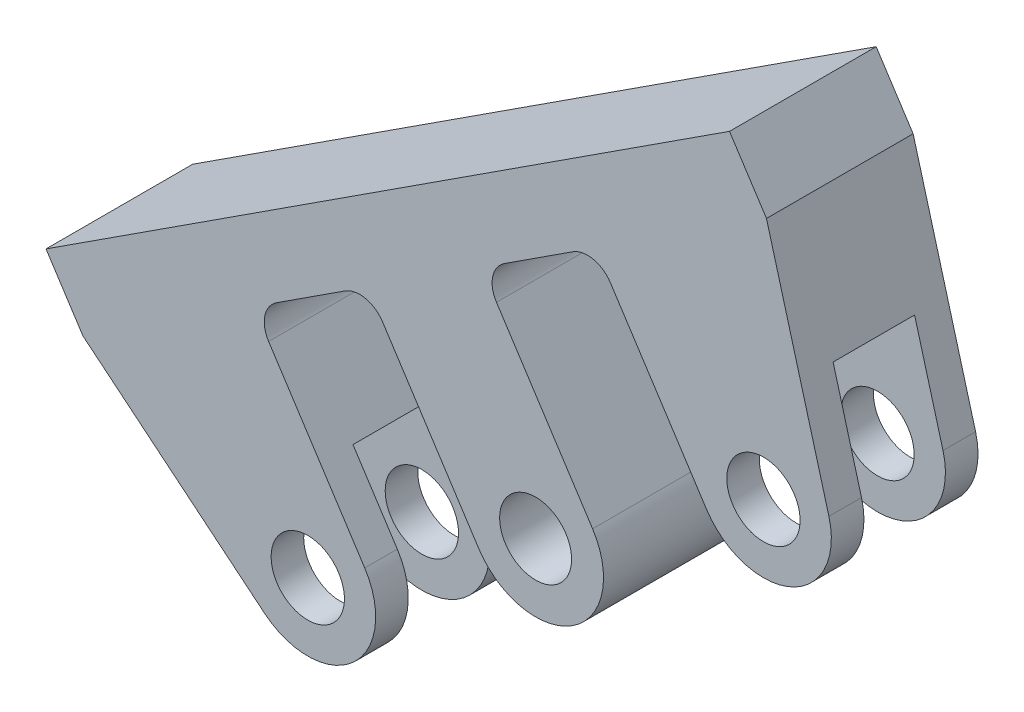
ISO-10303-21;
HEADER;
FILE_DESCRIPTION(('STEP AP214'),'2;1');
FILE_NAME('part.step','',(''),(''),'','','');
FILE_SCHEMA(('AUTOMOTIVE_DESIGN { 1 0 10303 214 1 1 1 1 }'));
ENDSEC;
DATA;
#1=APPLICATION_CONTEXT('core data for automotive mechanical design processes');
#2=APPLICATION_PROTOCOL_DEFINITION('international standard','automotive_design',2000,#1);
#3=PRODUCT_CONTEXT('',#1,'mechanical');
#4=PRODUCT('Part','Part','',(#3));
#5=PRODUCT_RELATED_PRODUCT_CATEGORY('part','',(#4));
#6=PRODUCT_DEFINITION_FORMATION('','',#4);
#7=PRODUCT_DEFINITION_CONTEXT('part definition',#1,'design');
#8=PRODUCT_DEFINITION('design','',#6,#7);
#9=PRODUCT_DEFINITION_SHAPE('','',#8);
#10=(LENGTH_UNIT() NAMED_UNIT(*) SI_UNIT(.MILLI.,.METRE.));
#11=(NAMED_UNIT(*) PLANE_ANGLE_UNIT() SI_UNIT($,.RADIAN.));
#12=(NAMED_UNIT(*) SI_UNIT($,.STERADIAN.) SOLID_ANGLE_UNIT());
#13=UNCERTAINTY_MEASURE_WITH_UNIT(LENGTH_MEASURE(1.E-05),#10,'distance_accuracy_value','');
#14=(GEOMETRIC_REPRESENTATION_CONTEXT(3) GLOBAL_UNCERTAINTY_ASSIGNED_CONTEXT((#13)) GLOBAL_UNIT_ASSIGNED_CONTEXT((#10,
#11,#12)) REPRESENTATION_CONTEXT('',''));
#15=CARTESIAN_POINT('',(0.,0.,0.));
#16=DIRECTION('',(0.,0.,1.));
#17=DIRECTION('',(1.,0.,0.));
#18=AXIS2_PLACEMENT_3D('',#15,#16,#17);
#19=CARTESIAN_POINT('',(-3.17337998993445,28.2201994932616,-50.8));
#20=DIRECTION('',(0.838850692859666,0.544361566505993,0.));
#21=DIRECTION('',(-0.544361566505993,0.838850692859666,0.));
#22=AXIS2_PLACEMENT_3D('',#19,#20,#21);
#23=PLANE('',#22);
#24=DIRECTION('',(0.,0.,1.));
#25=VECTOR('',#24,1.);
#26=CARTESIAN_POINT('',(0.283315957378587,22.8934975936028,-50.8));
#27=LINE('',#26,#25);
#28=CARTESIAN_POINT('',(0.283315957378587,22.8934975936028,-32.258));
#29=VERTEX_POINT('',#28);
#30=CARTESIAN_POINT('',(0.283315957378587,22.8934975936028,-18.542));
#31=VERTEX_POINT('',#30);
#32=EDGE_CURVE('E433',#29,#31,#27,.T.);
#33=ORIENTED_EDGE('',*,*,#32,.F.);
#34=DIRECTION('',(-0.544361566505993,0.838850692859666,0.));
#35=VECTOR('',#34,1.);
#36=CARTESIAN_POINT('',(-3.17337998993445,28.2201994932616,-32.258));
#37=LINE('',#36,#35);
#38=CARTESIAN_POINT('',(-3.17337998993444,28.2201994932616,-32.258));
#39=VERTEX_POINT('',#38);
#40=EDGE_CURVE('E562',#29,#39,#37,.T.);
#41=ORIENTED_EDGE('',*,*,#40,.T.);
#42=DIRECTION('',(0.,0.,1.));
#43=VECTOR('',#42,1.);
#44=CARTESIAN_POINT('',(-3.17337998993445,28.2201994932616,-50.8));
#45=LINE('',#44,#43);
#46=CARTESIAN_POINT('',(-3.17337998993444,28.2201994932616,-18.542));
#47=VERTEX_POINT('',#46);
#48=EDGE_CURVE('E319',#39,#47,#45,.T.);
#49=ORIENTED_EDGE('',*,*,#48,.T.);
#50=DIRECTION('',(-0.544361566505993,0.838850692859666,0.));
#51=VECTOR('',#50,1.);
#52=CARTESIAN_POINT('',(-3.17337998993445,28.2201994932616,-18.542));
#53=LINE('',#52,#51);
#54=EDGE_CURVE('E417',#31,#47,#53,.T.);
#55=ORIENTED_EDGE('',*,*,#54,.F.);
#56=EDGE_LOOP('',(#33,#41,#49,#55));
#57=FACE_BOUND('',#56,.T.);
#58=ADVANCED_FACE('F129',(#57),#23,.T.);
#59=CARTESIAN_POINT('',(-67.093802785841,-13.260151874495,-50.8));
#60=DIRECTION('',(-0.838850692859666,-0.544361566505993,0.));
#61=DIRECTION('',(0.544361566505993,-0.838850692859666,0.));
#62=AXIS2_PLACEMENT_3D('',#59,#60,#61);
#63=PLANE('',#62);
#64=DIRECTION('',(0.,0.,1.));
#65=VECTOR('',#64,1.);
#66=CARTESIAN_POINT('',(-67.093802785841,-13.260151874495,-50.8));
#67=LINE('',#66,#65);
#68=CARTESIAN_POINT('',(-67.093802785841,-13.2601518744951,-32.258));
#69=VERTEX_POINT('',#68);
#70=CARTESIAN_POINT('',(-67.093802785841,-13.2601518744951,-18.542));
#71=VERTEX_POINT('',#70);
#72=EDGE_CURVE('E317',#69,#71,#67,.T.);
#73=ORIENTED_EDGE('',*,*,#72,.F.);
#74=DIRECTION('',(0.544361566505993,-0.838850692859666,0.));
#75=VECTOR('',#74,1.);
#76=CARTESIAN_POINT('',(-67.093802785841,-13.260151874495,-32.258));
#77=LINE('',#76,#75);
#78=CARTESIAN_POINT('',(-63.637106838528,-18.5868537741538,-32.258));
#79=VERTEX_POINT('',#78);
#80=EDGE_CURVE('E299',#69,#79,#77,.T.);
#81=ORIENTED_EDGE('',*,*,#80,.T.);
#82=DIRECTION('',(0.,0.,1.));
#83=VECTOR('',#82,1.);
#84=CARTESIAN_POINT('',(-63.637106838528,-18.5868537741538,-50.8));
#85=LINE('',#84,#83);
#86=CARTESIAN_POINT('',(-63.637106838528,-18.5868537741538,-18.542));
#87=VERTEX_POINT('',#86);
#88=EDGE_CURVE('E422',#79,#87,#85,.T.);
#89=ORIENTED_EDGE('',*,*,#88,.T.);
#90=DIRECTION('',(0.544361566505993,-0.838850692859666,0.));
#91=VECTOR('',#90,1.);
#92=CARTESIAN_POINT('',(-67.093802785841,-13.260151874495,-18.542));
#93=LINE('',#92,#91);
#94=EDGE_CURVE('E325',#71,#87,#93,.T.);
#95=ORIENTED_EDGE('',*,*,#94,.F.);
#96=EDGE_LOOP('',(#73,#81,#89,#95));
#97=FACE_BOUND('',#96,.T.);
#98=ADVANCED_FACE('F323',(#97),#63,.T.);
#99=CARTESIAN_POINT('',(-3.17337998993445,28.2201994932616,-50.8));
#100=DIRECTION('',(-0.544361566505992,0.838850692859666,0.));
#101=DIRECTION('',(-0.838850692859666,-0.544361566505992,0.));
#102=AXIS2_PLACEMENT_3D('',#99,#100,#101);
#103=PLANE('',#102);
#104=ORIENTED_EDGE('',*,*,#48,.F.);
#105=DIRECTION('',(0.838850692859666,0.544361566505993,0.));
#106=VECTOR('',#105,1.);
#107=CARTESIAN_POINT('',(-76.5660362480968,-19.4070381913508,-32.258));
#108=LINE('',#107,#106);
#109=EDGE_CURVE('E303',#69,#39,#108,.T.);
#110=ORIENTED_EDGE('',*,*,#109,.F.);
#111=ORIENTED_EDGE('',*,*,#72,.T.);
#112=DIRECTION('',(0.838850692859666,0.544361566505993,0.));
#113=VECTOR('',#112,1.);
#114=CARTESIAN_POINT('',(-76.5660362480968,-19.4070381913508,-18.542));
#115=LINE('',#114,#113);
#116=EDGE_CURVE('E501',#71,#47,#115,.T.);
#117=ORIENTED_EDGE('',*,*,#116,.T.);
#118=EDGE_LOOP('',(#104,#110,#111,#117));
#119=FACE_BOUND('',#118,.T.);
#120=ADVANCED_FACE('F315',(#119),#103,.T.);
#121=CARTESIAN_POINT('',(-21.3068075986355,-13.8267837892522,-50.8));
#122=DIRECTION('',(0.,0.,1.));
#123=DIRECTION('',(1.,0.,0.));
#124=AXIS2_PLACEMENT_3D('',#121,#122,#123);
#125=CYLINDRICAL_SURFACE('',#124,6.35);
#126=CARTESIAN_POINT('',(-21.3068075986355,-13.8267837892522,-32.258));
#127=DIRECTION('',(0.,0.,-1.));
#128=DIRECTION('',(-1.,0.,0.));
#129=AXIS2_PLACEMENT_3D('',#126,#127,#128);
#130=CIRCLE('',#129,6.35);
#131=CARTESIAN_POINT('',(-26.6335094982944,-17.2834797365653,-32.258));
#132=VERTEX_POINT('',#131);
#133=CARTESIAN_POINT('',(-15.9801056989766,-10.3700878419392,-32.258));
#134=VERTEX_POINT('',#133);
#135=EDGE_CURVE('E393',#132,#134,#130,.F.);
#136=ORIENTED_EDGE('',*,*,#135,.T.);
#137=DIRECTION('',(0.,0.,1.));
#138=VECTOR('',#137,1.);
#139=CARTESIAN_POINT('',(-15.9801056989766,-10.3700878419392,-50.8));
#140=LINE('',#139,#138);
#141=CARTESIAN_POINT('',(-15.9801056989766,-10.3700878419392,-18.542));
#142=VERTEX_POINT('',#141);
#143=EDGE_CURVE('E392',#134,#142,#140,.T.);
#144=ORIENTED_EDGE('',*,*,#143,.T.);
#145=CARTESIAN_POINT('',(-21.3068075986355,-13.8267837892522,-18.542));
#146=DIRECTION('',(0.,0.,-1.));
#147=DIRECTION('',(0.,1.,0.));
#148=AXIS2_PLACEMENT_3D('',#145,#146,#147);
#149=CIRCLE('',#148,6.35);
#150=CARTESIAN_POINT('',(-26.6335094982944,-17.2834797365653,-18.542));
#151=VERTEX_POINT('',#150);
#152=EDGE_CURVE('E409',#151,#142,#149,.F.);
#153=ORIENTED_EDGE('',*,*,#152,.F.);
#154=DIRECTION('',(0.,0.,1.));
#155=VECTOR('',#154,1.);
#156=CARTESIAN_POINT('',(-26.6335094982944,-17.2834797365653,-50.8));
#157=LINE('',#156,#155);
#158=EDGE_CURVE('E457',#132,#151,#157,.T.);
#159=ORIENTED_EDGE('',*,*,#158,.F.);
#160=EDGE_LOOP('',(#136,#144,#153,#159));
#161=FACE_BOUND('',#160,.T.);
#162=ADVANCED_FACE('F576',(#161),#125,.T.);
#163=CARTESIAN_POINT('',(-42.6136151972711,-27.6535675785044,-50.8));
#164=DIRECTION('',(0.,0.,1.));
#165=DIRECTION('',(1.,0.,0.));
#166=AXIS2_PLACEMENT_3D('',#163,#164,#165);
#167=CYLINDRICAL_SURFACE('',#166,6.35);
#168=CARTESIAN_POINT('',(-42.6136151972711,-27.6535675785044,-32.258));
#169=DIRECTION('',(0.,0.,-1.));
#170=DIRECTION('',(-1.,0.,0.));
#171=AXIS2_PLACEMENT_3D('',#168,#169,#170);
#172=CIRCLE('',#171,6.35);
#173=CARTESIAN_POINT('',(-46.6468082414941,-32.5582443128092,-32.258));
#174=VERTEX_POINT('',#173);
#175=CARTESIAN_POINT('',(-37.2869132976122,-24.1968716311914,-32.258));
#176=VERTEX_POINT('',#175);
#177=EDGE_CURVE('E311',#174,#176,#172,.F.);
#178=ORIENTED_EDGE('',*,*,#177,.T.);
#179=DIRECTION('',(0.,0.,1.));
#180=VECTOR('',#179,1.);
#181=CARTESIAN_POINT('',(-37.2869132976122,-24.1968716311914,-50.8));
#182=LINE('',#181,#180);
#183=CARTESIAN_POINT('',(-37.2869132976122,-24.1968716311914,-29.21));
#184=VERTEX_POINT('',#183);
#185=EDGE_CURVE('E458',#176,#184,#182,.T.);
#186=ORIENTED_EDGE('',*,*,#185,.T.);
#187=CARTESIAN_POINT('',(-42.6136151972711,-27.6535675785044,-29.21));
#188=DIRECTION('',(0.,0.,1.));
#189=DIRECTION('',(1.,0.,0.));
#190=AXIS2_PLACEMENT_3D('',#187,#188,#189);
#191=CIRCLE('',#190,6.35);
#192=CARTESIAN_POINT('',(-46.6468082414941,-32.5582443128092,-29.21));
#193=VERTEX_POINT('',#192);
#194=EDGE_CURVE('E468',#193,#184,#191,.T.);
#195=ORIENTED_EDGE('',*,*,#194,.F.);
#196=DIRECTION('',(0.,0.,1.));
#197=VECTOR('',#196,1.);
#198=CARTESIAN_POINT('',(-46.6468082414941,-32.5582443128092,-50.8));
#199=LINE('',#198,#197);
#200=EDGE_CURVE('E420',#174,#193,#199,.T.);
#201=ORIENTED_EDGE('',*,*,#200,.F.);
#202=EDGE_LOOP('',(#178,#186,#195,#201));
#203=FACE_BOUND('',#202,.T.);
#204=ADVANCED_FACE('F506',(#203),#167,.T.);
#205=CARTESIAN_POINT('',(-37.2869132976122,-24.1968716311914,-50.8));
#206=DIRECTION('',(0.838850692859666,0.544361566505992,0.));
#207=DIRECTION('',(-0.544361566505992,0.838850692859667,0.));
#208=AXIS2_PLACEMENT_3D('',#205,#206,#207);
#209=PLANE('',#208);
#210=DIRECTION('',(-0.544361566505992,0.838850692859667,0.));
#211=VECTOR('',#210,1.);
#212=CARTESIAN_POINT('',(-37.2869132976122,-24.1968716311914,-32.258));
#213=LINE('',#212,#211);
#214=CARTESIAN_POINT('',(-46.2743227606261,-10.3474466920783,-32.258));
#215=VERTEX_POINT('',#214);
#216=EDGE_CURVE('E310',#176,#215,#213,.T.);
#217=ORIENTED_EDGE('',*,*,#216,.T.);
#218=DIRECTION('',(0.,0.,1.));
#219=VECTOR('',#218,1.);
#220=CARTESIAN_POINT('',(-46.2743227606261,-10.3474466920783,-18.542));
#221=LINE('',#220,#219);
#222=CARTESIAN_POINT('',(-46.2743227606261,-10.3474466920783,-18.542));
#223=VERTEX_POINT('',#222);
#224=EDGE_CURVE('E346',#215,#223,#221,.T.);
#225=ORIENTED_EDGE('',*,*,#224,.T.);
#226=DIRECTION('',(-0.544361566505992,0.838850692859667,0.));
#227=VECTOR('',#226,1.);
#228=CARTESIAN_POINT('',(-37.2869132976122,-24.1968716311914,-18.542));
#229=LINE('',#228,#227);
#230=CARTESIAN_POINT('',(-37.2869132976122,-24.1968716311914,-18.542));
#231=VERTEX_POINT('',#230);
#232=EDGE_CURVE('E566',#231,#223,#229,.T.);
#233=ORIENTED_EDGE('',*,*,#232,.F.);
#234=CARTESIAN_POINT('',(-37.2869132976122,-24.1968716311914,-21.59));
#235=VERTEX_POINT('',#234);
#236=EDGE_CURVE('E461',#235,#231,#182,.T.);
#237=ORIENTED_EDGE('',*,*,#236,.F.);
#238=DIRECTION('',(-0.544361566505992,0.838850692859667,0.));
#239=VECTOR('',#238,1.);
#240=CARTESIAN_POINT('',(-37.2869132976122,-24.1968716311914,-21.59));
#241=LINE('',#240,#239);
#242=CARTESIAN_POINT('',(-41.4349484343879,-17.8048293516007,-21.59));
#243=VERTEX_POINT('',#242);
#244=EDGE_CURVE('E460',#235,#243,#241,.T.);
#245=ORIENTED_EDGE('',*,*,#244,.T.);
#246=DIRECTION('',(0.,0.,-1.));
#247=VECTOR('',#246,1.);
#248=CARTESIAN_POINT('',(-41.4349484343878,-17.8048293516007,-29.21));
#249=LINE('',#248,#247);
#250=CARTESIAN_POINT('',(-41.4349484343878,-17.8048293516007,-29.21));
#251=VERTEX_POINT('',#250);
#252=EDGE_CURVE('E326',#243,#251,#249,.T.);
#253=ORIENTED_EDGE('',*,*,#252,.T.);
#254=DIRECTION('',(-0.544361566505992,0.838850692859667,0.));
#255=VECTOR('',#254,1.);
#256=CARTESIAN_POINT('',(-37.2869132976122,-24.1968716311914,-29.21));
#257=LINE('',#256,#255);
#258=EDGE_CURVE('E465',#184,#251,#257,.T.);
#259=ORIENTED_EDGE('',*,*,#258,.F.);
#260=ORIENTED_EDGE('',*,*,#185,.F.);
#261=EDGE_LOOP('',(#217,#225,#233,#237,#245,#253,#259,#260));
#262=FACE_BOUND('',#261,.T.);
#263=ADVANCED_FACE('F661',(#262),#209,.T.);
#264=CARTESIAN_POINT('',(-10.3700878419392,15.9801056989766,-50.8));
#265=DIRECTION('',(0.544361566505993,-0.838850692859666,0.));
#266=DIRECTION('',(0.838850692859666,0.544361566505993,0.));
#267=AXIS2_PLACEMENT_3D('',#264,#265,#266);
#268=PLANE('',#267);
#269=DIRECTION('',(0.838850692859666,0.544361566505993,0.));
#270=VECTOR('',#269,1.);
#271=CARTESIAN_POINT('',(-10.3700878419392,15.9801056989766,-18.542));
#272=LINE('',#271,#270);
#273=CARTESIAN_POINT('',(-45.5263203796878,-6.83408755328953,-18.542));
#274=VERTEX_POINT('',#273);
#275=CARTESIAN_POINT('',(-39.1342781000971,-2.68605241651385,-18.542));
#276=VERTEX_POINT('',#275);
#277=EDGE_CURVE('E568',#274,#276,#272,.T.);
#278=ORIENTED_EDGE('',*,*,#277,.F.);
#279=DIRECTION('',(0.,0.,1.));
#280=VECTOR('',#279,1.);
#281=CARTESIAN_POINT('',(-45.5263203796878,-6.83408755328953,-32.258));
#282=LINE('',#281,#280);
#283=CARTESIAN_POINT('',(-45.5263203796878,-6.83408755328953,-32.258));
#284=VERTEX_POINT('',#283);
#285=EDGE_CURVE('E352',#274,#284,#282,.F.);
#286=ORIENTED_EDGE('',*,*,#285,.T.);
#287=DIRECTION('',(0.838850692859666,0.544361566505993,0.));
#288=VECTOR('',#287,1.);
#289=CARTESIAN_POINT('',(-10.3700878419392,15.9801056989766,-32.258));
#290=LINE('',#289,#288);
#291=CARTESIAN_POINT('',(-39.1342781000971,-2.68605241651385,-32.258));
#292=VERTEX_POINT('',#291);
#293=EDGE_CURVE('E579',#284,#292,#290,.T.);
#294=ORIENTED_EDGE('',*,*,#293,.T.);
#295=DIRECTION('',(0.,0.,1.));
#296=VECTOR('',#295,1.);
#297=CARTESIAN_POINT('',(-39.1342781000971,-2.68605241651385,-18.542));
#298=LINE('',#297,#296);
#299=EDGE_CURVE('E349',#292,#276,#298,.T.);
#300=ORIENTED_EDGE('',*,*,#299,.T.);
#301=EDGE_LOOP('',(#278,#286,#294,#300));
#302=FACE_BOUND('',#301,.T.);
#303=ADVANCED_FACE('F664',(#302),#268,.T.);
#304=CARTESIAN_POINT('',(-26.6335094982944,-17.2834797365653,-50.8));
#305=DIRECTION('',(-0.838850692859666,-0.544361566505993,0.));
#306=DIRECTION('',(0.544361566505993,-0.838850692859666,0.));
#307=AXIS2_PLACEMENT_3D('',#304,#305,#306);
#308=PLANE('',#307);
#309=DIRECTION('',(0.544361566505993,-0.838850692859666,0.));
#310=VECTOR('',#309,1.);
#311=CARTESIAN_POINT('',(-26.6335094982944,-17.2834797365653,-18.542));
#312=LINE('',#311,#310);
#313=CARTESIAN_POINT('',(-35.6209189613083,-3.43405479745218,-18.542));
#314=VERTEX_POINT('',#313);
#315=EDGE_CURVE('E571',#314,#151,#312,.T.);
#316=ORIENTED_EDGE('',*,*,#315,.F.);
#317=DIRECTION('',(0.,0.,1.));
#318=VECTOR('',#317,1.);
#319=CARTESIAN_POINT('',(-35.6209189613083,-3.43405479745218,-32.258));
#320=LINE('',#319,#318);
#321=CARTESIAN_POINT('',(-35.6209189613083,-3.43405479745218,-32.258));
#322=VERTEX_POINT('',#321);
#323=EDGE_CURVE('E354',#314,#322,#320,.F.);
#324=ORIENTED_EDGE('',*,*,#323,.T.);
#325=DIRECTION('',(0.544361566505993,-0.838850692859666,0.));
#326=VECTOR('',#325,1.);
#327=CARTESIAN_POINT('',(-26.6335094982944,-17.2834797365653,-32.258));
#328=LINE('',#327,#326);
#329=EDGE_CURVE('E578',#322,#132,#328,.T.);
#330=ORIENTED_EDGE('',*,*,#329,.T.);
#331=ORIENTED_EDGE('',*,*,#158,.T.);
#332=EDGE_LOOP('',(#316,#324,#330,#331));
#333=FACE_BOUND('',#332,.T.);
#334=ADVANCED_FACE('F651',(#333),#308,.T.);
#335=CARTESIAN_POINT('',(0.,0.,-50.8));
#336=DIRECTION('',(0.,0.,1.));
#337=DIRECTION('',(1.,0.,0.));
#338=AXIS2_PLACEMENT_3D('',#335,#336,#337);
#339=CYLINDRICAL_SURFACE('',#338,6.35);
#340=CARTESIAN_POINT('',(0.,0.,-32.258));
#341=DIRECTION('',(0.,0.,-1.));
#342=DIRECTION('',(-1.,0.,0.));
#343=AXIS2_PLACEMENT_3D('',#340,#341,#342);
#344=CIRCLE('',#343,6.35);
#345=CARTESIAN_POINT('',(-5.32670189965887,-3.45669594731305,-32.258));
#346=VERTEX_POINT('',#345);
#347=CARTESIAN_POINT('',(6.12220907288694,1.6855432560041,-32.258));
#348=VERTEX_POINT('',#347);
#349=EDGE_CURVE('E554',#346,#348,#344,.F.);
#350=ORIENTED_EDGE('',*,*,#349,.T.);
#351=DIRECTION('',(0.,0.,1.));
#352=VECTOR('',#351,1.);
#353=CARTESIAN_POINT('',(6.12220907288693,1.6855432560041,-50.8));
#354=LINE('',#353,#352);
#355=CARTESIAN_POINT('',(6.12220907288693,1.6855432560041,-29.21));
#356=VERTEX_POINT('',#355);
#357=EDGE_CURVE('E436',#348,#356,#354,.T.);
#358=ORIENTED_EDGE('',*,*,#357,.T.);
#359=CARTESIAN_POINT('',(0.,0.,-29.21));
#360=DIRECTION('',(0.,0.,1.));
#361=DIRECTION('',(1.,0.,0.));
#362=AXIS2_PLACEMENT_3D('',#359,#360,#361);
#363=CIRCLE('',#362,6.35);
#364=CARTESIAN_POINT('',(-5.32670189965887,-3.45669594731305,-29.21));
#365=VERTEX_POINT('',#364);
#366=EDGE_CURVE('E454',#365,#356,#363,.T.);
#367=ORIENTED_EDGE('',*,*,#366,.F.);
#368=DIRECTION('',(0.,0.,1.));
#369=VECTOR('',#368,1.);
#370=CARTESIAN_POINT('',(-5.32670189965887,-3.45669594731305,-50.8));
#371=LINE('',#370,#369);
#372=EDGE_CURVE('E446',#346,#365,#371,.T.);
#373=ORIENTED_EDGE('',*,*,#372,.F.);
#374=EDGE_LOOP('',(#350,#358,#367,#373));
#375=FACE_BOUND('',#374,.T.);
#376=ADVANCED_FACE('F648',(#375),#339,.T.);
#377=CARTESIAN_POINT('',(-15.9801056989766,-10.3700878419392,-50.8));
#378=DIRECTION('',(0.838850692859666,0.544361566505993,0.));
#379=DIRECTION('',(-0.544361566505993,0.838850692859666,0.));
#380=AXIS2_PLACEMENT_3D('',#377,#378,#379);
#381=PLANE('',#380);
#382=DIRECTION('',(-0.544361566505993,0.838850692859666,0.));
#383=VECTOR('',#382,1.);
#384=CARTESIAN_POINT('',(-15.9801056989766,-10.3700878419392,-32.258));
#385=LINE('',#384,#383);
#386=CARTESIAN_POINT('',(-24.9675151619906,3.47933709717392,-32.258));
#387=VERTEX_POINT('',#386);
#388=EDGE_CURVE('E381',#134,#387,#385,.T.);
#389=ORIENTED_EDGE('',*,*,#388,.T.);
#390=DIRECTION('',(0.,0.,1.));
#391=VECTOR('',#390,1.);
#392=CARTESIAN_POINT('',(-24.9675151619906,3.47933709717392,-18.542));
#393=LINE('',#392,#391);
#394=CARTESIAN_POINT('',(-24.9675151619906,3.47933709717392,-18.542));
#395=VERTEX_POINT('',#394);
#396=EDGE_CURVE('E356',#387,#395,#393,.T.);
#397=ORIENTED_EDGE('',*,*,#396,.T.);
#398=DIRECTION('',(-0.544361566505993,0.838850692859666,0.));
#399=VECTOR('',#398,1.);
#400=CARTESIAN_POINT('',(-15.9801056989766,-10.3700878419392,-18.542));
#401=LINE('',#400,#399);
#402=EDGE_CURVE('E401',#142,#395,#401,.T.);
#403=ORIENTED_EDGE('',*,*,#402,.F.);
#404=ORIENTED_EDGE('',*,*,#143,.F.);
#405=EDGE_LOOP('',(#389,#397,#403,#404));
#406=FACE_BOUND('',#405,.T.);
#407=ADVANCED_FACE('F389',(#406),#381,.T.);
#408=CARTESIAN_POINT('',(-10.3700878419392,15.9801056989766,-50.8));
#409=DIRECTION('',(0.544361566505993,-0.838850692859666,0.));
#410=DIRECTION('',(0.838850692859666,0.544361566505993,0.));
#411=AXIS2_PLACEMENT_3D('',#408,#409,#410);
#412=PLANE('',#411);
#413=DIRECTION('',(0.838850692859666,0.544361566505993,0.));
#414=VECTOR('',#413,1.);
#415=CARTESIAN_POINT('',(-10.3700878419392,15.9801056989766,-18.542));
#416=LINE('',#415,#414);
#417=CARTESIAN_POINT('',(-24.2195127810522,6.9926962359627,-18.542));
#418=VERTEX_POINT('',#417);
#419=CARTESIAN_POINT('',(-17.8274705014616,11.1407313727384,-18.542));
#420=VERTEX_POINT('',#419);
#421=EDGE_CURVE('E399',#418,#420,#416,.T.);
#422=ORIENTED_EDGE('',*,*,#421,.F.);
#423=DIRECTION('',(0.,0.,1.));
#424=VECTOR('',#423,1.);
#425=CARTESIAN_POINT('',(-24.2195127810522,6.99269623596269,-32.258));
#426=LINE('',#425,#424);
#427=CARTESIAN_POINT('',(-24.2195127810522,6.9926962359627,-32.258));
#428=VERTEX_POINT('',#427);
#429=EDGE_CURVE('E362',#418,#428,#426,.F.);
#430=ORIENTED_EDGE('',*,*,#429,.T.);
#431=DIRECTION('',(0.838850692859666,0.544361566505993,0.));
#432=VECTOR('',#431,1.);
#433=CARTESIAN_POINT('',(-10.3700878419392,15.9801056989766,-32.258));
#434=LINE('',#433,#432);
#435=CARTESIAN_POINT('',(-17.8274705014616,11.1407313727384,-32.258));
#436=VERTEX_POINT('',#435);
#437=EDGE_CURVE('E384',#428,#436,#434,.T.);
#438=ORIENTED_EDGE('',*,*,#437,.T.);
#439=DIRECTION('',(0.,0.,1.));
#440=VECTOR('',#439,1.);
#441=CARTESIAN_POINT('',(-17.8274705014616,11.1407313727384,-18.542));
#442=LINE('',#441,#440);
#443=EDGE_CURVE('E359',#436,#420,#442,.T.);
#444=ORIENTED_EDGE('',*,*,#443,.T.);
#445=EDGE_LOOP('',(#422,#430,#438,#444));
#446=FACE_BOUND('',#445,.T.);
#447=ADVANCED_FACE('F403',(#446),#412,.T.);
#448=CARTESIAN_POINT('',(-5.32670189965887,-3.45669594731305,-50.8));
#449=DIRECTION('',(-0.838850692859666,-0.544361566505993,0.));
#450=DIRECTION('',(0.544361566505993,-0.838850692859666,0.));
#451=AXIS2_PLACEMENT_3D('',#448,#449,#450);
#452=PLANE('',#451);
#453=DIRECTION('',(0.544361566505993,-0.838850692859666,0.));
#454=VECTOR('',#453,1.);
#455=CARTESIAN_POINT('',(-5.32670189965888,-3.45669594731305,-18.542));
#456=LINE('',#455,#454);
#457=CARTESIAN_POINT('',(-14.3141113626728,10.3927289918,-18.542));
#458=VERTEX_POINT('',#457);
#459=CARTESIAN_POINT('',(-5.32670189965887,-3.45669594731305,-18.542));
#460=VERTEX_POINT('',#459);
#461=EDGE_CURVE('E405',#458,#460,#456,.T.);
#462=ORIENTED_EDGE('',*,*,#461,.F.);
#463=DIRECTION('',(0.,0.,1.));
#464=VECTOR('',#463,1.);
#465=CARTESIAN_POINT('',(-14.3141113626728,10.3927289918,-32.258));
#466=LINE('',#465,#464);
#467=CARTESIAN_POINT('',(-14.3141113626728,10.3927289918,-32.258));
#468=VERTEX_POINT('',#467);
#469=EDGE_CURVE('E150',#458,#468,#466,.F.);
#470=ORIENTED_EDGE('',*,*,#469,.T.);
#471=DIRECTION('',(0.544361566505993,-0.838850692859666,0.));
#472=VECTOR('',#471,1.);
#473=CARTESIAN_POINT('',(-5.32670189965887,-3.45669594731305,-32.258));
#474=LINE('',#473,#472);
#475=EDGE_CURVE('E552',#468,#346,#474,.T.);
#476=ORIENTED_EDGE('',*,*,#475,.T.);
#477=ORIENTED_EDGE('',*,*,#372,.T.);
#478=DIRECTION('',(0.544361566505993,-0.838850692859666,0.));
#479=VECTOR('',#478,1.);
#480=CARTESIAN_POINT('',(-5.32670189965887,-3.45669594731305,-29.21));
#481=LINE('',#480,#479);
#482=CARTESIAN_POINT('',(-9.47473703643455,2.93534633227761,-29.21));
#483=VERTEX_POINT('',#482);
#484=EDGE_CURVE('E451',#483,#365,#481,.T.);
#485=ORIENTED_EDGE('',*,*,#484,.F.);
#486=DIRECTION('',(0.,0.,-1.));
#487=VECTOR('',#486,1.);
#488=CARTESIAN_POINT('',(-9.47473703643455,2.93534633227761,-29.21));
#489=LINE('',#488,#487);
#490=CARTESIAN_POINT('',(-9.47473703643455,2.93534633227761,-21.59));
#491=VERTEX_POINT('',#490);
#492=EDGE_CURVE('E337',#491,#483,#489,.T.);
#493=ORIENTED_EDGE('',*,*,#492,.F.);
#494=DIRECTION('',(0.544361566505993,-0.838850692859666,0.));
#495=VECTOR('',#494,1.);
#496=CARTESIAN_POINT('',(-5.32670189965887,-3.45669594731305,-21.59));
#497=LINE('',#496,#495);
#498=CARTESIAN_POINT('',(-5.32670189965887,-3.45669594731305,-21.59));
#499=VERTEX_POINT('',#498);
#500=EDGE_CURVE('E449',#491,#499,#497,.T.);
#501=ORIENTED_EDGE('',*,*,#500,.T.);
#502=EDGE_CURVE('E445',#499,#460,#371,.T.);
#503=ORIENTED_EDGE('',*,*,#502,.T.);
#504=EDGE_LOOP('',(#462,#470,#476,#477,#485,#493,#501,#503));
#505=FACE_BOUND('',#504,.T.);
#506=ADVANCED_FACE('F646',(#505),#452,.T.);
#507=CARTESIAN_POINT('',(6.12220907288693,1.6855432560041,-50.8));
#508=DIRECTION('',(0.964127413053061,0.265439882835291,0.));
#509=DIRECTION('',(-0.265439882835291,0.964127413053061,0.));
#510=AXIS2_PLACEMENT_3D('',#507,#508,#509);
#511=PLANE('',#510);
#512=ORIENTED_EDGE('',*,*,#357,.F.);
#513=DIRECTION('',(-0.265439882835291,0.964127413053061,0.));
#514=VECTOR('',#513,1.);
#515=CARTESIAN_POINT('',(6.12220907288693,1.6855432560041,-32.258));
#516=LINE('',#515,#514);
#517=EDGE_CURVE('E559',#348,#29,#516,.T.);
#518=ORIENTED_EDGE('',*,*,#517,.T.);
#519=ORIENTED_EDGE('',*,*,#32,.T.);
#520=DIRECTION('',(-0.265439882835291,0.964127413053061,0.));
#521=VECTOR('',#520,1.);
#522=CARTESIAN_POINT('',(6.12220907288693,1.6855432560041,-18.542));
#523=LINE('',#522,#521);
#524=CARTESIAN_POINT('',(6.12220907288694,1.6855432560041,-18.542));
#525=VERTEX_POINT('',#524);
#526=EDGE_CURVE('E414',#525,#31,#523,.T.);
#527=ORIENTED_EDGE('',*,*,#526,.F.);
#528=CARTESIAN_POINT('',(6.12220907288693,1.6855432560041,-21.59));
#529=VERTEX_POINT('',#528);
#530=EDGE_CURVE('E432',#529,#525,#354,.T.);
#531=ORIENTED_EDGE('',*,*,#530,.F.);
#532=DIRECTION('',(-0.265439882835291,0.964127413053061,0.));
#533=VECTOR('',#532,1.);
#534=CARTESIAN_POINT('',(6.12220907288693,1.6855432560041,-21.59));
#535=LINE('',#534,#533);
#536=CARTESIAN_POINT('',(3.46607434514488,11.3331224985228,-21.59));
#537=VERTEX_POINT('',#536);
#538=EDGE_CURVE('E440',#529,#537,#535,.T.);
#539=ORIENTED_EDGE('',*,*,#538,.T.);
#540=DIRECTION('',(0.,0.,1.));
#541=VECTOR('',#540,1.);
#542=CARTESIAN_POINT('',(3.46607434514488,11.3331224985228,-29.21));
#543=LINE('',#542,#541);
#544=CARTESIAN_POINT('',(3.46607434514488,11.3331224985228,-29.21));
#545=VERTEX_POINT('',#544);
#546=EDGE_CURVE('E435',#545,#537,#543,.T.);
#547=ORIENTED_EDGE('',*,*,#546,.F.);
#548=DIRECTION('',(-0.265439882835291,0.964127413053061,0.));
#549=VECTOR('',#548,1.);
#550=CARTESIAN_POINT('',(6.12220907288693,1.6855432560041,-29.21));
#551=LINE('',#550,#549);
#552=EDGE_CURVE('E442',#356,#545,#551,.T.);
#553=ORIENTED_EDGE('',*,*,#552,.F.);
#554=EDGE_LOOP('',(#512,#518,#519,#527,#531,#539,#547,#553));
#555=FACE_BOUND('',#554,.T.);
#556=ADVANCED_FACE('F521',(#555),#511,.T.);
#557=CARTESIAN_POINT('',(-34.7904593238612,-42.3079070479733,-50.8));
#558=DIRECTION('',(0.635148510901264,0.772390036898397,0.));
#559=DIRECTION('',(-0.772390036898397,0.635148510901264,0.));
#560=AXIS2_PLACEMENT_3D('',#557,#558,#559);
#561=PLANE('',#560);
#562=DIRECTION('',(-0.772390036898397,0.635148510901264,0.));
#563=VECTOR('',#562,1.);
#564=CARTESIAN_POINT('',(-34.7904593238612,-42.3079070479733,-32.258));
#565=LINE('',#564,#563);
#566=EDGE_CURVE('E306',#174,#79,#565,.T.);
#567=ORIENTED_EDGE('',*,*,#566,.F.);
#568=ORIENTED_EDGE('',*,*,#200,.T.);
#569=DIRECTION('',(-0.772390036898397,0.635148510901264,0.));
#570=VECTOR('',#569,1.);
#571=CARTESIAN_POINT('',(-34.7904593238612,-42.3079070479733,-29.21));
#572=LINE('',#571,#570);
#573=CARTESIAN_POINT('',(-54.3757598159673,-26.2026055178459,-29.21));
#574=VERTEX_POINT('',#573);
#575=EDGE_CURVE('E430',#193,#574,#572,.T.);
#576=ORIENTED_EDGE('',*,*,#575,.T.);
#577=DIRECTION('',(0.,0.,-1.));
#578=VECTOR('',#577,1.);
#579=CARTESIAN_POINT('',(-54.3757598159673,-26.2026055178459,-29.21));
#580=LINE('',#579,#578);
#581=CARTESIAN_POINT('',(-54.3757598159673,-26.2026055178459,-21.59));
#582=VERTEX_POINT('',#581);
#583=EDGE_CURVE('E424',#582,#574,#580,.T.);
#584=ORIENTED_EDGE('',*,*,#583,.F.);
#585=DIRECTION('',(-0.772390036898397,0.635148510901264,0.));
#586=VECTOR('',#585,1.);
#587=CARTESIAN_POINT('',(-34.7904593238612,-42.3079070479733,-21.59));
#588=LINE('',#587,#586);
#589=CARTESIAN_POINT('',(-46.6468082414941,-32.5582443128092,-21.59));
#590=VERTEX_POINT('',#589);
#591=EDGE_CURVE('E427',#590,#582,#588,.T.);
#592=ORIENTED_EDGE('',*,*,#591,.F.);
#593=CARTESIAN_POINT('',(-46.6468082414941,-32.5582443128092,-18.542));
#594=VERTEX_POINT('',#593);
#595=EDGE_CURVE('E419',#590,#594,#199,.T.);
#596=ORIENTED_EDGE('',*,*,#595,.T.);
#597=DIRECTION('',(-0.772390036898397,0.635148510901264,0.));
#598=VECTOR('',#597,1.);
#599=CARTESIAN_POINT('',(-34.7904593238612,-42.3079070479733,-18.542));
#600=LINE('',#599,#598);
#601=EDGE_CURVE('E342',#594,#87,#600,.T.);
#602=ORIENTED_EDGE('',*,*,#601,.T.);
#603=ORIENTED_EDGE('',*,*,#88,.F.);
#604=EDGE_LOOP('',(#567,#568,#576,#584,#592,#596,#602,#603));
#605=FACE_BOUND('',#604,.T.);
#606=ADVANCED_FACE('F492',(#605),#561,.F.);
#607=CARTESIAN_POINT('',(0.,0.,-29.21));
#608=DIRECTION('',(0.,0.,1.));
#609=DIRECTION('',(1.,0.,0.));
#610=AXIS2_PLACEMENT_3D('',#607,#608,#609);
#611=PLANE('',#610);
#612=CARTESIAN_POINT('',(-42.6136151972711,-27.6535675785044,-29.21));
#613=DIRECTION('',(0.,0.,1.));
#614=DIRECTION('',(1.,0.,0.));
#615=AXIS2_PLACEMENT_3D('',#612,#613,#614);
#616=CIRCLE('',#615,3.429);
#617=CARTESIAN_POINT('',(-39.1846151972711,-27.6535675785044,-29.21));
#618=VERTEX_POINT('',#617);
#619=EDGE_CURVE('E602',#618,#618,#616,.T.);
#620=ORIENTED_EDGE('',*,*,#619,.F.);
#621=EDGE_LOOP('',(#620));
#622=FACE_BOUND('',#621,.T.);
#623=ORIENTED_EDGE('',*,*,#575,.F.);
#624=ORIENTED_EDGE('',*,*,#194,.T.);
#625=ORIENTED_EDGE('',*,*,#258,.T.);
#626=DIRECTION('',(-0.838850692859666,-0.544361566505993,0.));
#627=VECTOR('',#626,1.);
#628=CARTESIAN_POINT('',(-4.14803513677566,6.39204227959066,-29.21));
#629=LINE('',#628,#627);
#630=EDGE_CURVE('E330',#251,#574,#629,.T.);
#631=ORIENTED_EDGE('',*,*,#630,.T.);
#632=EDGE_LOOP('',(#623,#624,#625,#631));
#633=FACE_BOUND('',#632,.T.);
#634=ADVANCED_FACE('F510',(#622,#633),#611,.T.);
#635=CARTESIAN_POINT('',(0.,0.,-21.59));
#636=DIRECTION('',(0.,0.,1.));
#637=DIRECTION('',(1.,0.,0.));
#638=AXIS2_PLACEMENT_3D('',#635,#636,#637);
#639=PLANE('',#638);
#640=CARTESIAN_POINT('',(-42.6136151972711,-27.6535675785044,-21.59));
#641=DIRECTION('',(0.,0.,1.));
#642=DIRECTION('',(1.,0.,0.));
#643=AXIS2_PLACEMENT_3D('',#640,#641,#642);
#644=CIRCLE('',#643,3.429);
#645=CARTESIAN_POINT('',(-39.1846151972711,-27.6535675785044,-21.59));
#646=VERTEX_POINT('',#645);
#647=EDGE_CURVE('E607',#646,#646,#644,.T.);
#648=ORIENTED_EDGE('',*,*,#647,.T.);
#649=EDGE_LOOP('',(#648));
#650=FACE_BOUND('',#649,.T.);
#651=CARTESIAN_POINT('',(-42.6136151972711,-27.6535675785044,-21.59));
#652=DIRECTION('',(0.,0.,1.));
#653=DIRECTION('',(1.,0.,0.));
#654=AXIS2_PLACEMENT_3D('',#651,#652,#653);
#655=CIRCLE('',#654,6.35);
#656=EDGE_CURVE('E328',#590,#235,#655,.T.);
#657=ORIENTED_EDGE('',*,*,#656,.F.);
#658=ORIENTED_EDGE('',*,*,#591,.T.);
#659=DIRECTION('',(-0.838850692859666,-0.544361566505993,0.));
#660=VECTOR('',#659,1.);
#661=CARTESIAN_POINT('',(-4.14803513677566,6.39204227959066,-21.59));
#662=LINE('',#661,#660);
#663=EDGE_CURVE('E333',#243,#582,#662,.T.);
#664=ORIENTED_EDGE('',*,*,#663,.F.);
#665=ORIENTED_EDGE('',*,*,#244,.F.);
#666=EDGE_LOOP('',(#657,#658,#664,#665));
#667=FACE_BOUND('',#666,.T.);
#668=ADVANCED_FACE('F487',(#650,#667),#639,.F.);
#669=CARTESIAN_POINT('',(0.,0.,-29.21));
#670=DIRECTION('',(0.,0.,1.));
#671=DIRECTION('',(1.,0.,0.));
#672=AXIS2_PLACEMENT_3D('',#669,#670,#671);
#673=PLANE('',#672);
#674=CARTESIAN_POINT('',(0.,0.,-29.21));
#675=DIRECTION('',(0.,0.,1.));
#676=DIRECTION('',(1.,0.,0.));
#677=AXIS2_PLACEMENT_3D('',#674,#675,#676);
#678=CIRCLE('',#677,3.429);
#679=CARTESIAN_POINT('',(3.429,0.,-29.21));
#680=VERTEX_POINT('',#679);
#681=EDGE_CURVE('E320',#680,#680,#678,.T.);
#682=ORIENTED_EDGE('',*,*,#681,.F.);
#683=EDGE_LOOP('',(#682));
#684=FACE_BOUND('',#683,.T.);
#685=ORIENTED_EDGE('',*,*,#366,.T.);
#686=ORIENTED_EDGE('',*,*,#552,.T.);
#687=DIRECTION('',(0.838850692859666,0.544361566505993,0.));
#688=VECTOR('',#687,1.);
#689=CARTESIAN_POINT('',(-4.14803513677567,6.39204227959066,-29.21));
#690=LINE('',#689,#688);
#691=EDGE_CURVE('E472',#483,#545,#690,.T.);
#692=ORIENTED_EDGE('',*,*,#691,.F.);
#693=ORIENTED_EDGE('',*,*,#484,.T.);
#694=EDGE_LOOP('',(#685,#686,#692,#693));
#695=FACE_BOUND('',#694,.T.);
#696=ADVANCED_FACE('F518',(#684,#695),#673,.T.);
#697=CARTESIAN_POINT('',(0.,0.,-21.59));
#698=DIRECTION('',(0.,0.,1.));
#699=DIRECTION('',(1.,0.,0.));
#700=AXIS2_PLACEMENT_3D('',#697,#698,#699);
#701=PLANE('',#700);
#702=CARTESIAN_POINT('',(0.,0.,-21.59));
#703=DIRECTION('',(0.,0.,1.));
#704=DIRECTION('',(1.,0.,0.));
#705=AXIS2_PLACEMENT_3D('',#702,#703,#704);
#706=CIRCLE('',#705,3.429);
#707=CARTESIAN_POINT('',(3.429,0.,-21.59));
#708=VERTEX_POINT('',#707);
#709=EDGE_CURVE('E589',#708,#708,#706,.T.);
#710=ORIENTED_EDGE('',*,*,#709,.T.);
#711=EDGE_LOOP('',(#710));
#712=FACE_BOUND('',#711,.T.);
#713=ORIENTED_EDGE('',*,*,#538,.F.);
#714=CARTESIAN_POINT('',(0.,0.,-21.59));
#715=DIRECTION('',(0.,0.,1.));
#716=DIRECTION('',(1.,0.,0.));
#717=AXIS2_PLACEMENT_3D('',#714,#715,#716);
#718=CIRCLE('',#717,6.35);
#719=EDGE_CURVE('E340',#499,#529,#718,.T.);
#720=ORIENTED_EDGE('',*,*,#719,.F.);
#721=ORIENTED_EDGE('',*,*,#500,.F.);
#722=DIRECTION('',(0.838850692859666,0.544361566505993,0.));
#723=VECTOR('',#722,1.);
#724=CARTESIAN_POINT('',(-4.14803513677567,6.39204227959066,-21.59));
#725=LINE('',#724,#723);
#726=EDGE_CURVE('E471',#491,#537,#725,.T.);
#727=ORIENTED_EDGE('',*,*,#726,.T.);
#728=EDGE_LOOP('',(#713,#720,#721,#727));
#729=FACE_BOUND('',#728,.T.);
#730=ADVANCED_FACE('F676',(#712,#729),#701,.F.);
#731=CARTESIAN_POINT('',(-4.14803513677567,6.39204227959066,-29.21));
#732=DIRECTION('',(0.544361566505993,-0.838850692859666,0.));
#733=DIRECTION('',(0.838850692859666,0.544361566505993,0.));
#734=AXIS2_PLACEMENT_3D('',#731,#732,#733);
#735=PLANE('',#734);
#736=ORIENTED_EDGE('',*,*,#691,.T.);
#737=ORIENTED_EDGE('',*,*,#546,.T.);
#738=ORIENTED_EDGE('',*,*,#726,.F.);
#739=ORIENTED_EDGE('',*,*,#492,.T.);
#740=EDGE_LOOP('',(#736,#737,#738,#739));
#741=FACE_BOUND('',#740,.T.);
#742=ADVANCED_FACE('F679',(#741),#735,.T.);
#743=CARTESIAN_POINT('',(-4.14803513677566,6.39204227959066,-29.21));
#744=DIRECTION('',(-0.544361566505992,0.838850692859666,0.));
#745=DIRECTION('',(-0.838850692859666,-0.544361566505992,0.));
#746=AXIS2_PLACEMENT_3D('',#743,#744,#745);
#747=PLANE('',#746);
#748=ORIENTED_EDGE('',*,*,#663,.T.);
#749=ORIENTED_EDGE('',*,*,#583,.T.);
#750=ORIENTED_EDGE('',*,*,#630,.F.);
#751=ORIENTED_EDGE('',*,*,#252,.F.);
#752=EDGE_LOOP('',(#748,#749,#750,#751));
#753=FACE_BOUND('',#752,.T.);
#754=ADVANCED_FACE('F484',(#753),#747,.F.);
#755=CARTESIAN_POINT('',(-42.6136151972711,-27.6535675785044,-18.542));
#756=DIRECTION('',(0.,0.,-1.));
#757=DIRECTION('',(0.,1.,0.));
#758=AXIS2_PLACEMENT_3D('',#755,#756,#757);
#759=CIRCLE('',#758,6.35);
#760=EDGE_CURVE('E497',#594,#231,#759,.F.);
#761=ORIENTED_EDGE('',*,*,#760,.F.);
#762=ORIENTED_EDGE('',*,*,#595,.F.);
#763=ORIENTED_EDGE('',*,*,#656,.T.);
#764=ORIENTED_EDGE('',*,*,#236,.T.);
#765=EDGE_LOOP('',(#761,#762,#763,#764));
#766=FACE_BOUND('',#765,.T.);
#767=ADVANCED_FACE('F494',(#766),#167,.T.);
#768=CARTESIAN_POINT('',(0.,0.,-18.542));
#769=DIRECTION('',(0.,0.,-1.));
#770=DIRECTION('',(0.,1.,0.));
#771=AXIS2_PLACEMENT_3D('',#768,#769,#770);
#772=CIRCLE('',#771,6.35);
#773=EDGE_CURVE('E407',#460,#525,#772,.F.);
#774=ORIENTED_EDGE('',*,*,#773,.F.);
#775=ORIENTED_EDGE('',*,*,#502,.F.);
#776=ORIENTED_EDGE('',*,*,#719,.T.);
#777=ORIENTED_EDGE('',*,*,#530,.T.);
#778=EDGE_LOOP('',(#774,#775,#776,#777));
#779=FACE_BOUND('',#778,.T.);
#780=ADVANCED_FACE('F642',(#779),#339,.T.);
#781=CARTESIAN_POINT('',(-62.7392524588445,-40.7138457899863,-18.542));
#782=DIRECTION('',(0.,0.,-1.));
#783=DIRECTION('',(0.,1.,0.));
#784=AXIS2_PLACEMENT_3D('',#781,#782,#783);
#785=PLANE('',#784);
#786=CARTESIAN_POINT('',(-42.6136151972711,-27.6535675785044,-18.542));
#787=DIRECTION('',(0.,0.,-1.));
#788=DIRECTION('',(-1.,0.,0.));
#789=AXIS2_PLACEMENT_3D('',#786,#787,#788);
#790=CIRCLE('',#789,3.429);
#791=CARTESIAN_POINT('',(-46.0426151972711,-27.6535675785044,-18.542));
#792=VERTEX_POINT('',#791);
#793=EDGE_CURVE('E610',#792,#792,#790,.T.);
#794=ORIENTED_EDGE('',*,*,#793,.T.);
#795=EDGE_LOOP('',(#794));
#796=FACE_BOUND('',#795,.T.);
#797=CARTESIAN_POINT('',(-21.3068075986355,-13.8267837892522,-18.542));
#798=DIRECTION('',(0.,0.,-1.));
#799=DIRECTION('',(-1.,0.,0.));
#800=AXIS2_PLACEMENT_3D('',#797,#798,#799);
#801=CIRCLE('',#800,3.3655);
#802=CARTESIAN_POINT('',(-24.6723075986355,-13.8267837892522,-18.542));
#803=VERTEX_POINT('',#802);
#804=EDGE_CURVE('E596',#803,#803,#801,.T.);
#805=ORIENTED_EDGE('',*,*,#804,.T.);
#806=EDGE_LOOP('',(#805));
#807=FACE_BOUND('',#806,.T.);
#808=CARTESIAN_POINT('',(0.,0.,-18.542));
#809=DIRECTION('',(0.,0.,-1.));
#810=DIRECTION('',(-1.,0.,0.));
#811=AXIS2_PLACEMENT_3D('',#808,#809,#810);
#812=CIRCLE('',#811,3.429);
#813=CARTESIAN_POINT('',(-3.429,0.,-18.542));
#814=VERTEX_POINT('',#813);
#815=EDGE_CURVE('E592',#814,#814,#812,.T.);
#816=ORIENTED_EDGE('',*,*,#815,.T.);
#817=EDGE_LOOP('',(#816));
#818=FACE_BOUND('',#817,.T.);
#819=ORIENTED_EDGE('',*,*,#54,.T.);
#820=ORIENTED_EDGE('',*,*,#116,.F.);
#821=ORIENTED_EDGE('',*,*,#94,.T.);
#822=ORIENTED_EDGE('',*,*,#601,.F.);
#823=ORIENTED_EDGE('',*,*,#760,.T.);
#824=ORIENTED_EDGE('',*,*,#232,.T.);
#825=CARTESIAN_POINT('',(-44.1436420007626,-8.96476831315308,-18.542));
#826=DIRECTION('',(0.,0.,-1.));
#827=DIRECTION('',(0.,1.,0.));
#828=AXIS2_PLACEMENT_3D('',#825,#826,#827);
#829=CIRCLE('',#828,2.54);
#830=EDGE_CURVE('E365',#223,#274,#829,.T.);
#831=ORIENTED_EDGE('',*,*,#830,.T.);
#832=ORIENTED_EDGE('',*,*,#277,.T.);
#833=CARTESIAN_POINT('',(-37.7515997211719,-4.8167331763774,-18.542));
#834=DIRECTION('',(0.,0.,-1.));
#835=DIRECTION('',(0.,1.,0.));
#836=AXIS2_PLACEMENT_3D('',#833,#834,#835);
#837=CIRCLE('',#836,2.54);
#838=EDGE_CURVE('E369',#276,#314,#837,.T.);
#839=ORIENTED_EDGE('',*,*,#838,.T.);
#840=ORIENTED_EDGE('',*,*,#315,.T.);
#841=ORIENTED_EDGE('',*,*,#152,.T.);
#842=ORIENTED_EDGE('',*,*,#402,.T.);
#843=CARTESIAN_POINT('',(-22.836834402127,4.86201547609914,-18.542));
#844=DIRECTION('',(0.,0.,-1.));
#845=DIRECTION('',(0.,1.,0.));
#846=AXIS2_PLACEMENT_3D('',#843,#844,#845);
#847=CIRCLE('',#846,2.54);
#848=EDGE_CURVE('E373',#395,#418,#847,.T.);
#849=ORIENTED_EDGE('',*,*,#848,.T.);
#850=ORIENTED_EDGE('',*,*,#421,.T.);
#851=CARTESIAN_POINT('',(-16.4447921225364,9.01005061287481,-18.542));
#852=DIRECTION('',(0.,0.,-1.));
#853=DIRECTION('',(0.,1.,0.));
#854=AXIS2_PLACEMENT_3D('',#851,#852,#853);
#855=CIRCLE('',#854,2.54);
#856=EDGE_CURVE('E137',#420,#458,#855,.T.);
#857=ORIENTED_EDGE('',*,*,#856,.T.);
#858=ORIENTED_EDGE('',*,*,#461,.T.);
#859=ORIENTED_EDGE('',*,*,#773,.T.);
#860=ORIENTED_EDGE('',*,*,#526,.T.);
#861=EDGE_LOOP('',(#819,#820,#821,#822,#823,#824,#831,#832,#839,#840,#841,#842,#849,#850,#857,
#858,#859,#860));
#862=FACE_BOUND('',#861,.T.);
#863=ADVANCED_FACE('F398',(#796,#807,#818,#862),#785,.F.);
#864=CARTESIAN_POINT('',(-62.7392524588445,-40.7138457899863,-32.258));
#865=DIRECTION('',(0.,0.,-1.));
#866=DIRECTION('',(-1.,0.,0.));
#867=AXIS2_PLACEMENT_3D('',#864,#865,#866);
#868=PLANE('',#867);
#869=CARTESIAN_POINT('',(-42.6136151972711,-27.6535675785044,-32.258));
#870=DIRECTION('',(0.,0.,-1.));
#871=DIRECTION('',(-1.,0.,0.));
#872=AXIS2_PLACEMENT_3D('',#869,#870,#871);
#873=CIRCLE('',#872,3.429);
#874=CARTESIAN_POINT('',(-46.0426151972711,-27.6535675785044,-32.258));
#875=VERTEX_POINT('',#874);
#876=EDGE_CURVE('E611',#875,#875,#873,.T.);
#877=ORIENTED_EDGE('',*,*,#876,.F.);
#878=EDGE_LOOP('',(#877));
#879=FACE_BOUND('',#878,.T.);
#880=CARTESIAN_POINT('',(-21.3068075986355,-13.8267837892522,-32.258));
#881=DIRECTION('',(0.,0.,-1.));
#882=DIRECTION('',(-1.,0.,0.));
#883=AXIS2_PLACEMENT_3D('',#880,#881,#882);
#884=CIRCLE('',#883,3.3655);
#885=CARTESIAN_POINT('',(-24.6723075986355,-13.8267837892522,-32.258));
#886=VERTEX_POINT('',#885);
#887=EDGE_CURVE('E599',#886,#886,#884,.T.);
#888=ORIENTED_EDGE('',*,*,#887,.F.);
#889=EDGE_LOOP('',(#888));
#890=FACE_BOUND('',#889,.T.);
#891=CARTESIAN_POINT('',(0.,0.,-32.258));
#892=DIRECTION('',(0.,0.,-1.));
#893=DIRECTION('',(-1.,0.,0.));
#894=AXIS2_PLACEMENT_3D('',#891,#892,#893);
#895=CIRCLE('',#894,3.429);
#896=CARTESIAN_POINT('',(-3.429,0.,-32.258));
#897=VERTEX_POINT('',#896);
#898=EDGE_CURVE('E593',#897,#897,#895,.T.);
#899=ORIENTED_EDGE('',*,*,#898,.F.);
#900=EDGE_LOOP('',(#899));
#901=FACE_BOUND('',#900,.T.);
#902=ORIENTED_EDGE('',*,*,#517,.F.);
#903=ORIENTED_EDGE('',*,*,#349,.F.);
#904=ORIENTED_EDGE('',*,*,#475,.F.);
#905=CARTESIAN_POINT('',(-16.4447921225364,9.01005061287481,-32.258));
#906=DIRECTION('',(0.,0.,-1.));
#907=DIRECTION('',(-1.,0.,0.));
#908=AXIS2_PLACEMENT_3D('',#905,#906,#907);
#909=CIRCLE('',#908,2.54);
#910=EDGE_CURVE('E12',#468,#436,#909,.F.);
#911=ORIENTED_EDGE('',*,*,#910,.T.);
#912=ORIENTED_EDGE('',*,*,#437,.F.);
#913=CARTESIAN_POINT('',(-22.836834402127,4.86201547609914,-32.258));
#914=DIRECTION('',(0.,0.,-1.));
#915=DIRECTION('',(-1.,0.,0.));
#916=AXIS2_PLACEMENT_3D('',#913,#914,#915);
#917=CIRCLE('',#916,2.54);
#918=EDGE_CURVE('E375',#428,#387,#917,.F.);
#919=ORIENTED_EDGE('',*,*,#918,.T.);
#920=ORIENTED_EDGE('',*,*,#388,.F.);
#921=ORIENTED_EDGE('',*,*,#135,.F.);
#922=ORIENTED_EDGE('',*,*,#329,.F.);
#923=CARTESIAN_POINT('',(-37.7515997211719,-4.8167331763774,-32.258));
#924=DIRECTION('',(0.,0.,-1.));
#925=DIRECTION('',(-1.,0.,0.));
#926=AXIS2_PLACEMENT_3D('',#923,#924,#925);
#927=CIRCLE('',#926,2.54);
#928=EDGE_CURVE('E371',#322,#292,#927,.F.);
#929=ORIENTED_EDGE('',*,*,#928,.T.);
#930=ORIENTED_EDGE('',*,*,#293,.F.);
#931=CARTESIAN_POINT('',(-44.1436420007626,-8.96476831315308,-32.258));
#932=DIRECTION('',(0.,0.,-1.));
#933=DIRECTION('',(-1.,0.,0.));
#934=AXIS2_PLACEMENT_3D('',#931,#932,#933);
#935=CIRCLE('',#934,2.54);
#936=EDGE_CURVE('E367',#284,#215,#935,.F.);
#937=ORIENTED_EDGE('',*,*,#936,.T.);
#938=ORIENTED_EDGE('',*,*,#216,.F.);
#939=ORIENTED_EDGE('',*,*,#177,.F.);
#940=ORIENTED_EDGE('',*,*,#566,.T.);
#941=ORIENTED_EDGE('',*,*,#80,.F.);
#942=ORIENTED_EDGE('',*,*,#109,.T.);
#943=ORIENTED_EDGE('',*,*,#40,.F.);
#944=EDGE_LOOP('',(#902,#903,#904,#911,#912,#919,#920,#921,#922,#929,#930,#937,#938,#939,#940,
#941,#942,#943));
#945=FACE_BOUND('',#944,.T.);
#946=ADVANCED_FACE('F302',(#879,#890,#901,#945),#868,.T.);
#947=CARTESIAN_POINT('',(0.,0.,-18.542));
#948=DIRECTION('',(0.,0.,-1.));
#949=DIRECTION('',(-1.,0.,0.));
#950=AXIS2_PLACEMENT_3D('',#947,#948,#949);
#951=CYLINDRICAL_SURFACE('',#950,3.429);
#952=ORIENTED_EDGE('',*,*,#681,.T.);
#953=EDGE_LOOP('',(#952));
#954=FACE_BOUND('',#953,.T.);
#955=ORIENTED_EDGE('',*,*,#898,.T.);
#956=EDGE_LOOP('',(#955));
#957=FACE_BOUND('',#956,.T.);
#958=ADVANCED_FACE('F634',(#954,#957),#951,.F.);
#959=ORIENTED_EDGE('',*,*,#815,.F.);
#960=EDGE_LOOP('',(#959));
#961=FACE_BOUND('',#960,.T.);
#962=ORIENTED_EDGE('',*,*,#709,.F.);
#963=EDGE_LOOP('',(#962));
#964=FACE_BOUND('',#963,.T.);
#965=ADVANCED_FACE('F632',(#961,#964),#951,.F.);
#966=CARTESIAN_POINT('',(-21.3068075986355,-13.8267837892522,-18.542));
#967=DIRECTION('',(0.,0.,-1.));
#968=DIRECTION('',(-1.,0.,0.));
#969=AXIS2_PLACEMENT_3D('',#966,#967,#968);
#970=CYLINDRICAL_SURFACE('',#969,3.3655);
#971=ORIENTED_EDGE('',*,*,#804,.F.);
#972=EDGE_LOOP('',(#971));
#973=FACE_BOUND('',#972,.T.);
#974=ORIENTED_EDGE('',*,*,#887,.T.);
#975=EDGE_LOOP('',(#974));
#976=FACE_BOUND('',#975,.T.);
#977=ADVANCED_FACE('F627',(#973,#976),#970,.F.);
#978=CARTESIAN_POINT('',(-42.6136151972711,-27.6535675785044,-18.542));
#979=DIRECTION('',(0.,0.,-1.));
#980=DIRECTION('',(-1.,0.,0.));
#981=AXIS2_PLACEMENT_3D('',#978,#979,#980);
#982=CYLINDRICAL_SURFACE('',#981,3.429);
#983=ORIENTED_EDGE('',*,*,#619,.T.);
#984=EDGE_LOOP('',(#983));
#985=FACE_BOUND('',#984,.T.);
#986=ORIENTED_EDGE('',*,*,#876,.T.);
#987=EDGE_LOOP('',(#986));
#988=FACE_BOUND('',#987,.T.);
#989=ADVANCED_FACE('F621',(#985,#988),#982,.F.);
#990=ORIENTED_EDGE('',*,*,#793,.F.);
#991=EDGE_LOOP('',(#990));
#992=FACE_BOUND('',#991,.T.);
#993=ORIENTED_EDGE('',*,*,#647,.F.);
#994=EDGE_LOOP('',(#993));
#995=FACE_BOUND('',#994,.T.);
#996=ADVANCED_FACE('F539',(#992,#995),#982,.F.);
#997=CARTESIAN_POINT('',(-44.1436420007626,-8.96476831315308,-50.8));
#998=DIRECTION('',(0.,0.,-1.));
#999=DIRECTION('',(-1.,0.,0.));
#1000=AXIS2_PLACEMENT_3D('',#997,#998,#999);
#1001=CYLINDRICAL_SURFACE('',#1000,2.54);
#1002=ORIENTED_EDGE('',*,*,#936,.F.);
#1003=ORIENTED_EDGE('',*,*,#285,.F.);
#1004=ORIENTED_EDGE('',*,*,#830,.F.);
#1005=ORIENTED_EDGE('',*,*,#224,.F.);
#1006=EDGE_LOOP('',(#1002,#1003,#1004,#1005));
#1007=FACE_BOUND('',#1006,.T.);
#1008=ADVANCED_FACE('F535',(#1007),#1001,.F.);
#1009=CARTESIAN_POINT('',(-37.7515997211719,-4.8167331763774,-50.8));
#1010=DIRECTION('',(0.,0.,-1.));
#1011=DIRECTION('',(-1.,0.,0.));
#1012=AXIS2_PLACEMENT_3D('',#1009,#1010,#1011);
#1013=CYLINDRICAL_SURFACE('',#1012,2.54);
#1014=ORIENTED_EDGE('',*,*,#928,.F.);
#1015=ORIENTED_EDGE('',*,*,#323,.F.);
#1016=ORIENTED_EDGE('',*,*,#838,.F.);
#1017=ORIENTED_EDGE('',*,*,#299,.F.);
#1018=EDGE_LOOP('',(#1014,#1015,#1016,#1017));
#1019=FACE_BOUND('',#1018,.T.);
#1020=ADVANCED_FACE('F538',(#1019),#1013,.F.);
#1021=CARTESIAN_POINT('',(-22.836834402127,4.86201547609914,-50.8));
#1022=DIRECTION('',(0.,0.,-1.));
#1023=DIRECTION('',(-1.,0.,0.));
#1024=AXIS2_PLACEMENT_3D('',#1021,#1022,#1023);
#1025=CYLINDRICAL_SURFACE('',#1024,2.54);
#1026=ORIENTED_EDGE('',*,*,#918,.F.);
#1027=ORIENTED_EDGE('',*,*,#429,.F.);
#1028=ORIENTED_EDGE('',*,*,#848,.F.);
#1029=ORIENTED_EDGE('',*,*,#396,.F.);
#1030=EDGE_LOOP('',(#1026,#1027,#1028,#1029));
#1031=FACE_BOUND('',#1030,.T.);
#1032=ADVANCED_FACE('F395',(#1031),#1025,.F.);
#1033=CARTESIAN_POINT('',(-16.4447921225364,9.01005061287481,-50.8));
#1034=DIRECTION('',(0.,0.,-1.));
#1035=DIRECTION('',(-1.,0.,0.));
#1036=AXIS2_PLACEMENT_3D('',#1033,#1034,#1035);
#1037=CYLINDRICAL_SURFACE('',#1036,2.54);
#1038=ORIENTED_EDGE('',*,*,#910,.F.);
#1039=ORIENTED_EDGE('',*,*,#469,.F.);
#1040=ORIENTED_EDGE('',*,*,#856,.F.);
#1041=ORIENTED_EDGE('',*,*,#443,.F.);
#1042=EDGE_LOOP('',(#1038,#1039,#1040,#1041));
#1043=FACE_BOUND('',#1042,.T.);
#1044=ADVANCED_FACE('F131',(#1043),#1037,.F.);
#1045=CLOSED_SHELL('',(#58,#98,#120,#162,#204,#263,#303,#334,#376,#407,#447,#506,#556,#606,#634,
#668,#696,#730,#742,#754,#767,#780,#863,#946,#958,#965,#977,#989,#996,#1008,#1020,#1032,#1044));
#1046=MANIFOLD_SOLID_BREP('B2',#1045);
#1047=ADVANCED_BREP_SHAPE_REPRESENTATION('',(#18,#1046),#14);
#1048=SHAPE_DEFINITION_REPRESENTATION(#9,#1047);
ENDSEC;
END-ISO-10303-21;
